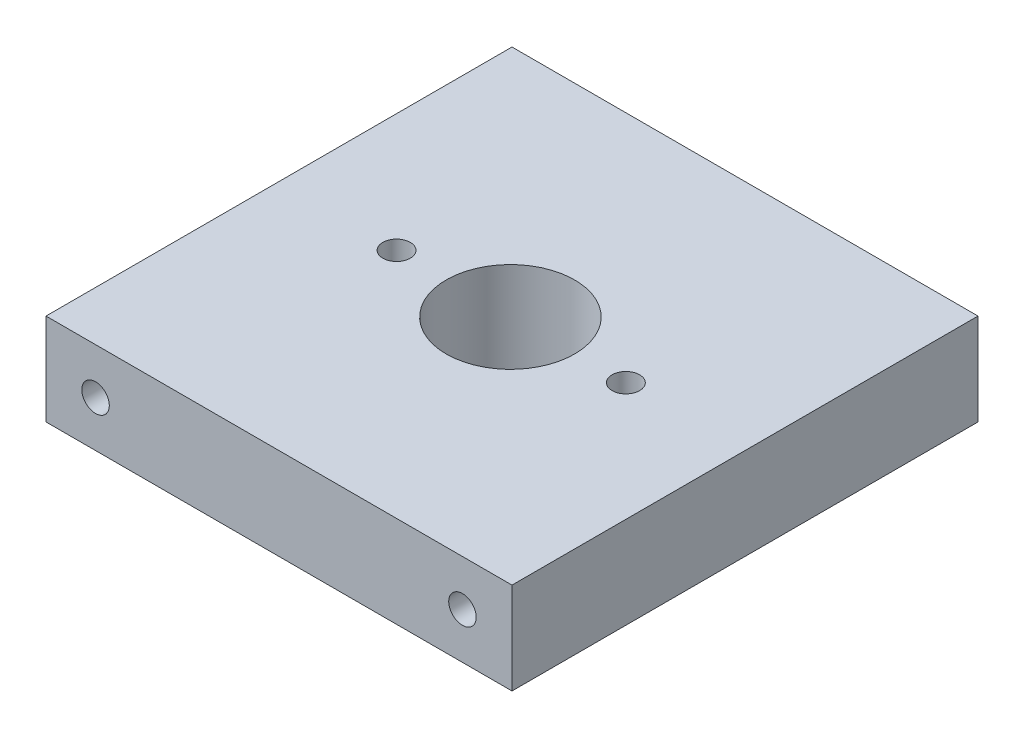
ISO-10303-21;
HEADER;
FILE_DESCRIPTION(('STEP AP214'),'2;1');
FILE_NAME('part.step','',(''),(''),'','','');
FILE_SCHEMA(('AUTOMOTIVE_DESIGN { 1 0 10303 214 1 1 1 1 }'));
ENDSEC;
DATA;
#1=APPLICATION_CONTEXT('core data for automotive mechanical design processes');
#2=APPLICATION_PROTOCOL_DEFINITION('international standard','automotive_design',2000,#1);
#3=PRODUCT_CONTEXT('',#1,'mechanical');
#4=PRODUCT('Part','Part','',(#3));
#5=PRODUCT_RELATED_PRODUCT_CATEGORY('part','',(#4));
#6=PRODUCT_DEFINITION_FORMATION('','',#4);
#7=PRODUCT_DEFINITION_CONTEXT('part definition',#1,'design');
#8=PRODUCT_DEFINITION('design','',#6,#7);
#9=PRODUCT_DEFINITION_SHAPE('','',#8);
#10=(LENGTH_UNIT() NAMED_UNIT(*) SI_UNIT(.MILLI.,.METRE.));
#11=(NAMED_UNIT(*) PLANE_ANGLE_UNIT() SI_UNIT($,.RADIAN.));
#12=(NAMED_UNIT(*) SI_UNIT($,.STERADIAN.) SOLID_ANGLE_UNIT());
#13=UNCERTAINTY_MEASURE_WITH_UNIT(LENGTH_MEASURE(1.E-05),#10,'distance_accuracy_value','');
#14=(GEOMETRIC_REPRESENTATION_CONTEXT(3) GLOBAL_UNCERTAINTY_ASSIGNED_CONTEXT((#13)) GLOBAL_UNIT_ASSIGNED_CONTEXT((#10,
#11,#12)) REPRESENTATION_CONTEXT('',''));
#15=CARTESIAN_POINT('',(0.,0.,0.));
#16=DIRECTION('',(0.,0.,1.));
#17=DIRECTION('',(1.,0.,0.));
#18=AXIS2_PLACEMENT_3D('',#15,#16,#17);
#19=CARTESIAN_POINT('',(25.4,10.,-25.4));
#20=DIRECTION('',(-1.,0.,0.));
#21=DIRECTION('',(0.,0.,1.));
#22=AXIS2_PLACEMENT_3D('',#19,#20,#21);
#23=PLANE('',#22);
#24=DIRECTION('',(0.,0.,-1.));
#25=VECTOR('',#24,1.);
#26=CARTESIAN_POINT('',(25.4,0.,-25.4));
#27=LINE('',#26,#25);
#28=CARTESIAN_POINT('',(25.4,0.,25.4));
#29=VERTEX_POINT('',#28);
#30=CARTESIAN_POINT('',(25.4,0.,-25.4));
#31=VERTEX_POINT('',#30);
#32=EDGE_CURVE('E97',#29,#31,#27,.T.);
#33=ORIENTED_EDGE('',*,*,#32,.T.);
#34=DIRECTION('',(0.,-1.,0.));
#35=VECTOR('',#34,1.);
#36=CARTESIAN_POINT('',(25.4,10.,-25.4));
#37=LINE('',#36,#35);
#38=CARTESIAN_POINT('',(25.4,10.,-25.4));
#39=VERTEX_POINT('',#38);
#40=EDGE_CURVE('E11',#39,#31,#37,.T.);
#41=ORIENTED_EDGE('',*,*,#40,.F.);
#42=DIRECTION('',(0.,0.,-1.));
#43=VECTOR('',#42,1.);
#44=CARTESIAN_POINT('',(25.4,10.,-25.4));
#45=LINE('',#44,#43);
#46=CARTESIAN_POINT('',(25.4,10.,25.4));
#47=VERTEX_POINT('',#46);
#48=EDGE_CURVE('E85',#47,#39,#45,.T.);
#49=ORIENTED_EDGE('',*,*,#48,.F.);
#50=DIRECTION('',(0.,-1.,0.));
#51=VECTOR('',#50,1.);
#52=CARTESIAN_POINT('',(25.4,10.,25.4));
#53=LINE('',#52,#51);
#54=EDGE_CURVE('E93',#47,#29,#53,.T.);
#55=ORIENTED_EDGE('',*,*,#54,.T.);
#56=EDGE_LOOP('',(#33,#41,#49,#55));
#57=FACE_BOUND('',#56,.T.);
#58=ADVANCED_FACE('F34',(#57),#23,.F.);
#59=CARTESIAN_POINT('',(-25.4,10.,-25.4));
#60=DIRECTION('',(0.,0.,1.));
#61=DIRECTION('',(1.,0.,0.));
#62=AXIS2_PLACEMENT_3D('',#59,#60,#61);
#63=PLANE('',#62);
#64=CARTESIAN_POINT('',(20.,5.,-25.4));
#65=DIRECTION('',(0.,0.,-1.));
#66=DIRECTION('',(1.,0.,0.));
#67=AXIS2_PLACEMENT_3D('',#64,#65,#66);
#68=CIRCLE('',#67,1.5);
#69=CARTESIAN_POINT('',(21.5,5.,-25.4));
#70=VERTEX_POINT('',#69);
#71=EDGE_CURVE('E135',#70,#70,#68,.T.);
#72=ORIENTED_EDGE('',*,*,#71,.F.);
#73=EDGE_LOOP('',(#72));
#74=FACE_BOUND('',#73,.T.);
#75=CARTESIAN_POINT('',(-20.,5.,-25.4));
#76=DIRECTION('',(0.,0.,-1.));
#77=DIRECTION('',(-1.,0.,0.));
#78=AXIS2_PLACEMENT_3D('',#75,#76,#77);
#79=CIRCLE('',#78,1.5);
#80=CARTESIAN_POINT('',(-21.5,5.,-25.4));
#81=VERTEX_POINT('',#80);
#82=EDGE_CURVE('E129',#81,#81,#79,.T.);
#83=ORIENTED_EDGE('',*,*,#82,.F.);
#84=EDGE_LOOP('',(#83));
#85=FACE_BOUND('',#84,.T.);
#86=DIRECTION('',(-1.,0.,0.));
#87=VECTOR('',#86,1.);
#88=CARTESIAN_POINT('',(-25.4,0.,-25.4));
#89=LINE('',#88,#87);
#90=CARTESIAN_POINT('',(-25.4,0.,-25.4));
#91=VERTEX_POINT('',#90);
#92=EDGE_CURVE('E89',#31,#91,#89,.T.);
#93=ORIENTED_EDGE('',*,*,#92,.T.);
#94=DIRECTION('',(0.,-1.,0.));
#95=VECTOR('',#94,1.);
#96=CARTESIAN_POINT('',(-25.4,10.,-25.4));
#97=LINE('',#96,#95);
#98=CARTESIAN_POINT('',(-25.4,10.,-25.4));
#99=VERTEX_POINT('',#98);
#100=EDGE_CURVE('E42',#99,#91,#97,.T.);
#101=ORIENTED_EDGE('',*,*,#100,.F.);
#102=DIRECTION('',(-1.,0.,0.));
#103=VECTOR('',#102,1.);
#104=CARTESIAN_POINT('',(-25.4,10.,-25.4));
#105=LINE('',#104,#103);
#106=EDGE_CURVE('E80',#39,#99,#105,.T.);
#107=ORIENTED_EDGE('',*,*,#106,.F.);
#108=ORIENTED_EDGE('',*,*,#40,.T.);
#109=EDGE_LOOP('',(#93,#101,#107,#108));
#110=FACE_BOUND('',#109,.T.);
#111=ADVANCED_FACE('F88',(#74,#85,#110),#63,.F.);
#112=CARTESIAN_POINT('',(-25.4,10.,-25.4));
#113=DIRECTION('',(1.,0.,0.));
#114=DIRECTION('',(0.,0.,-1.));
#115=AXIS2_PLACEMENT_3D('',#112,#113,#114);
#116=PLANE('',#115);
#117=DIRECTION('',(0.,0.,1.));
#118=VECTOR('',#117,1.);
#119=CARTESIAN_POINT('',(-25.4,0.,-25.4));
#120=LINE('',#119,#118);
#121=CARTESIAN_POINT('',(-25.4,0.,25.4));
#122=VERTEX_POINT('',#121);
#123=EDGE_CURVE('E67',#91,#122,#120,.T.);
#124=ORIENTED_EDGE('',*,*,#123,.T.);
#125=DIRECTION('',(0.,-1.,0.));
#126=VECTOR('',#125,1.);
#127=CARTESIAN_POINT('',(-25.4,10.,25.4));
#128=LINE('',#127,#126);
#129=CARTESIAN_POINT('',(-25.4,10.,25.4));
#130=VERTEX_POINT('',#129);
#131=EDGE_CURVE('E90',#130,#122,#128,.T.);
#132=ORIENTED_EDGE('',*,*,#131,.F.);
#133=DIRECTION('',(0.,0.,1.));
#134=VECTOR('',#133,1.);
#135=CARTESIAN_POINT('',(-25.4,10.,-25.4));
#136=LINE('',#135,#134);
#137=EDGE_CURVE('E83',#99,#130,#136,.T.);
#138=ORIENTED_EDGE('',*,*,#137,.F.);
#139=ORIENTED_EDGE('',*,*,#100,.T.);
#140=EDGE_LOOP('',(#124,#132,#138,#139));
#141=FACE_BOUND('',#140,.T.);
#142=ADVANCED_FACE('F91',(#141),#116,.F.);
#143=CARTESIAN_POINT('',(-25.4,10.,25.4));
#144=DIRECTION('',(0.,0.,-1.));
#145=DIRECTION('',(-1.,0.,0.));
#146=AXIS2_PLACEMENT_3D('',#143,#144,#145);
#147=PLANE('',#146);
#148=CARTESIAN_POINT('',(20.,5.,25.4));
#149=DIRECTION('',(0.,0.,-1.));
#150=DIRECTION('',(1.,0.,0.));
#151=AXIS2_PLACEMENT_3D('',#148,#149,#150);
#152=CIRCLE('',#151,1.5);
#153=CARTESIAN_POINT('',(21.5,5.,25.4));
#154=VERTEX_POINT('',#153);
#155=EDGE_CURVE('E132',#154,#154,#152,.T.);
#156=ORIENTED_EDGE('',*,*,#155,.T.);
#157=EDGE_LOOP('',(#156));
#158=FACE_BOUND('',#157,.T.);
#159=CARTESIAN_POINT('',(-20.,5.,25.4));
#160=DIRECTION('',(0.,0.,-1.));
#161=DIRECTION('',(-1.,0.,0.));
#162=AXIS2_PLACEMENT_3D('',#159,#160,#161);
#163=CIRCLE('',#162,1.5);
#164=CARTESIAN_POINT('',(-21.5,5.,25.4));
#165=VERTEX_POINT('',#164);
#166=EDGE_CURVE('E126',#165,#165,#163,.T.);
#167=ORIENTED_EDGE('',*,*,#166,.T.);
#168=EDGE_LOOP('',(#167));
#169=FACE_BOUND('',#168,.T.);
#170=DIRECTION('',(1.,0.,0.));
#171=VECTOR('',#170,1.);
#172=CARTESIAN_POINT('',(-25.4,0.,25.4));
#173=LINE('',#172,#171);
#174=EDGE_CURVE('E73',#122,#29,#173,.T.);
#175=ORIENTED_EDGE('',*,*,#174,.T.);
#176=ORIENTED_EDGE('',*,*,#54,.F.);
#177=DIRECTION('',(1.,0.,0.));
#178=VECTOR('',#177,1.);
#179=CARTESIAN_POINT('',(-25.4,10.,25.4));
#180=LINE('',#179,#178);
#181=EDGE_CURVE('E50',#130,#47,#180,.T.);
#182=ORIENTED_EDGE('',*,*,#181,.F.);
#183=ORIENTED_EDGE('',*,*,#131,.T.);
#184=EDGE_LOOP('',(#175,#176,#182,#183));
#185=FACE_BOUND('',#184,.T.);
#186=ADVANCED_FACE('F105',(#158,#169,#185),#147,.F.);
#187=CARTESIAN_POINT('',(0.,10.,0.));
#188=DIRECTION('',(0.,1.,0.));
#189=DIRECTION('',(0.,0.,1.));
#190=AXIS2_PLACEMENT_3D('',#187,#188,#189);
#191=PLANE('',#190);
#192=CARTESIAN_POINT('',(12.5,10.,0.0874669124806017));
#193=DIRECTION('',(0.,1.,0.));
#194=DIRECTION('',(0.,0.,-1.));
#195=AXIS2_PLACEMENT_3D('',#192,#193,#194);
#196=CIRCLE('',#195,1.5);
#197=CARTESIAN_POINT('',(12.5,10.,-1.4125330875194));
#198=VERTEX_POINT('',#197);
#199=EDGE_CURVE('E123',#198,#198,#196,.T.);
#200=ORIENTED_EDGE('',*,*,#199,.F.);
#201=EDGE_LOOP('',(#200));
#202=FACE_BOUND('',#201,.T.);
#203=CARTESIAN_POINT('',(-12.5,10.,0.0874669124806047));
#204=DIRECTION('',(0.,1.,0.));
#205=DIRECTION('',(0.,0.,1.));
#206=AXIS2_PLACEMENT_3D('',#203,#204,#205);
#207=CIRCLE('',#206,1.5);
#208=CARTESIAN_POINT('',(-12.5,10.,1.58746691248061));
#209=VERTEX_POINT('',#208);
#210=EDGE_CURVE('E117',#209,#209,#207,.T.);
#211=ORIENTED_EDGE('',*,*,#210,.F.);
#212=EDGE_LOOP('',(#211));
#213=FACE_BOUND('',#212,.T.);
#214=CARTESIAN_POINT('',(0.,10.,0.172221672636229));
#215=DIRECTION('',(0.,1.,0.));
#216=DIRECTION('',(0.,0.,1.));
#217=AXIS2_PLACEMENT_3D('',#214,#215,#216);
#218=CIRCLE('',#217,7.);
#219=CARTESIAN_POINT('',(0.,10.,7.17222167263623));
#220=VERTEX_POINT('',#219);
#221=EDGE_CURVE('E111',#220,#220,#218,.T.);
#222=ORIENTED_EDGE('',*,*,#221,.F.);
#223=EDGE_LOOP('',(#222));
#224=FACE_BOUND('',#223,.T.);
#225=ORIENTED_EDGE('',*,*,#48,.T.);
#226=ORIENTED_EDGE('',*,*,#106,.T.);
#227=ORIENTED_EDGE('',*,*,#137,.T.);
#228=ORIENTED_EDGE('',*,*,#181,.T.);
#229=EDGE_LOOP('',(#225,#226,#227,#228));
#230=FACE_BOUND('',#229,.T.);
#231=ADVANCED_FACE('F81',(#202,#213,#224,#230),#191,.T.);
#232=CARTESIAN_POINT('',(0.,0.,0.));
#233=DIRECTION('',(0.,1.,0.));
#234=DIRECTION('',(0.,0.,1.));
#235=AXIS2_PLACEMENT_3D('',#232,#233,#234);
#236=PLANE('',#235);
#237=CARTESIAN_POINT('',(12.5,0.,0.0874669124806017));
#238=DIRECTION('',(0.,1.,0.));
#239=DIRECTION('',(0.,0.,-1.));
#240=AXIS2_PLACEMENT_3D('',#237,#238,#239);
#241=CIRCLE('',#240,1.5);
#242=CARTESIAN_POINT('',(12.5,0.,-1.4125330875194));
#243=VERTEX_POINT('',#242);
#244=EDGE_CURVE('E120',#243,#243,#241,.T.);
#245=ORIENTED_EDGE('',*,*,#244,.T.);
#246=EDGE_LOOP('',(#245));
#247=FACE_BOUND('',#246,.T.);
#248=CARTESIAN_POINT('',(-12.5,0.,0.0874669124806047));
#249=DIRECTION('',(0.,1.,0.));
#250=DIRECTION('',(0.,0.,1.));
#251=AXIS2_PLACEMENT_3D('',#248,#249,#250);
#252=CIRCLE('',#251,1.5);
#253=CARTESIAN_POINT('',(-12.5,0.,1.58746691248061));
#254=VERTEX_POINT('',#253);
#255=EDGE_CURVE('E114',#254,#254,#252,.T.);
#256=ORIENTED_EDGE('',*,*,#255,.T.);
#257=EDGE_LOOP('',(#256));
#258=FACE_BOUND('',#257,.T.);
#259=CARTESIAN_POINT('',(0.,0.,0.172221672636229));
#260=DIRECTION('',(0.,1.,0.));
#261=DIRECTION('',(0.,0.,1.));
#262=AXIS2_PLACEMENT_3D('',#259,#260,#261);
#263=CIRCLE('',#262,7.);
#264=CARTESIAN_POINT('',(0.,0.,7.17222167263623));
#265=VERTEX_POINT('',#264);
#266=EDGE_CURVE('E100',#265,#265,#263,.T.);
#267=ORIENTED_EDGE('',*,*,#266,.T.);
#268=EDGE_LOOP('',(#267));
#269=FACE_BOUND('',#268,.T.);
#270=ORIENTED_EDGE('',*,*,#32,.F.);
#271=ORIENTED_EDGE('',*,*,#174,.F.);
#272=ORIENTED_EDGE('',*,*,#123,.F.);
#273=ORIENTED_EDGE('',*,*,#92,.F.);
#274=EDGE_LOOP('',(#270,#271,#272,#273));
#275=FACE_BOUND('',#274,.T.);
#276=ADVANCED_FACE('F108',(#247,#258,#269,#275),#236,.F.);
#277=CARTESIAN_POINT('',(0.,0.,0.172221672636229));
#278=DIRECTION('',(0.,1.,0.));
#279=DIRECTION('',(0.,0.,1.));
#280=AXIS2_PLACEMENT_3D('',#277,#278,#279);
#281=CYLINDRICAL_SURFACE('',#280,7.);
#282=ORIENTED_EDGE('',*,*,#266,.F.);
#283=EDGE_LOOP('',(#282));
#284=FACE_BOUND('',#283,.T.);
#285=ORIENTED_EDGE('',*,*,#221,.T.);
#286=EDGE_LOOP('',(#285));
#287=FACE_BOUND('',#286,.T.);
#288=ADVANCED_FACE('F202',(#284,#287),#281,.F.);
#289=CARTESIAN_POINT('',(-12.5,0.,0.0874669124806047));
#290=DIRECTION('',(0.,1.,0.));
#291=DIRECTION('',(0.,0.,1.));
#292=AXIS2_PLACEMENT_3D('',#289,#290,#291);
#293=CYLINDRICAL_SURFACE('',#292,1.5);
#294=ORIENTED_EDGE('',*,*,#255,.F.);
#295=EDGE_LOOP('',(#294));
#296=FACE_BOUND('',#295,.T.);
#297=ORIENTED_EDGE('',*,*,#210,.T.);
#298=EDGE_LOOP('',(#297));
#299=FACE_BOUND('',#298,.T.);
#300=ADVANCED_FACE('F161',(#296,#299),#293,.F.);
#301=CARTESIAN_POINT('',(12.5,0.,0.0874669124806017));
#302=DIRECTION('',(0.,1.,0.));
#303=DIRECTION('',(0.,0.,1.));
#304=AXIS2_PLACEMENT_3D('',#301,#302,#303);
#305=CYLINDRICAL_SURFACE('',#304,1.5);
#306=ORIENTED_EDGE('',*,*,#244,.F.);
#307=EDGE_LOOP('',(#306));
#308=FACE_BOUND('',#307,.T.);
#309=ORIENTED_EDGE('',*,*,#199,.T.);
#310=EDGE_LOOP('',(#309));
#311=FACE_BOUND('',#310,.T.);
#312=ADVANCED_FACE('F155',(#308,#311),#305,.F.);
#313=CARTESIAN_POINT('',(-20.,5.,25.4));
#314=DIRECTION('',(0.,0.,-1.));
#315=DIRECTION('',(-1.,0.,0.));
#316=AXIS2_PLACEMENT_3D('',#313,#314,#315);
#317=CYLINDRICAL_SURFACE('',#316,1.5);
#318=ORIENTED_EDGE('',*,*,#166,.F.);
#319=EDGE_LOOP('',(#318));
#320=FACE_BOUND('',#319,.T.);
#321=ORIENTED_EDGE('',*,*,#82,.T.);
#322=EDGE_LOOP('',(#321));
#323=FACE_BOUND('',#322,.T.);
#324=ADVANCED_FACE('F146',(#320,#323),#317,.F.);
#325=CARTESIAN_POINT('',(20.,5.,25.4));
#326=DIRECTION('',(0.,0.,-1.));
#327=DIRECTION('',(-1.,0.,0.));
#328=AXIS2_PLACEMENT_3D('',#325,#326,#327);
#329=CYLINDRICAL_SURFACE('',#328,1.5);
#330=ORIENTED_EDGE('',*,*,#155,.F.);
#331=EDGE_LOOP('',(#330));
#332=FACE_BOUND('',#331,.T.);
#333=ORIENTED_EDGE('',*,*,#71,.T.);
#334=EDGE_LOOP('',(#333));
#335=FACE_BOUND('',#334,.T.);
#336=ADVANCED_FACE('F143',(#332,#335),#329,.F.);
#337=CLOSED_SHELL('',(#58,#111,#142,#186,#231,#276,#288,#300,#312,#324,#336));
#338=MANIFOLD_SOLID_BREP('B2',#337);
#339=ADVANCED_BREP_SHAPE_REPRESENTATION('',(#18,#338),#14);
#340=SHAPE_DEFINITION_REPRESENTATION(#9,#339);
ENDSEC;
END-ISO-10303-21;
